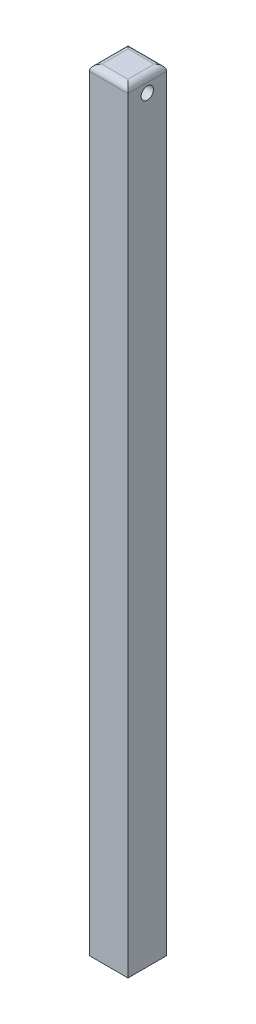
ISO-10303-21;
HEADER;
FILE_DESCRIPTION(('STEP AP214'),'2;1');
FILE_NAME('part.step','',(''),(''),'','','');
FILE_SCHEMA(('AUTOMOTIVE_DESIGN { 1 0 10303 214 1 1 1 1 }'));
ENDSEC;
DATA;
#1=APPLICATION_CONTEXT('core data for automotive mechanical design processes');
#2=APPLICATION_PROTOCOL_DEFINITION('international standard','automotive_design',2000,#1);
#3=PRODUCT_CONTEXT('',#1,'mechanical');
#4=PRODUCT('Part','Part','',(#3));
#5=PRODUCT_RELATED_PRODUCT_CATEGORY('part','',(#4));
#6=PRODUCT_DEFINITION_FORMATION('','',#4);
#7=PRODUCT_DEFINITION_CONTEXT('part definition',#1,'design');
#8=PRODUCT_DEFINITION('design','',#6,#7);
#9=PRODUCT_DEFINITION_SHAPE('','',#8);
#10=(LENGTH_UNIT() NAMED_UNIT(*) SI_UNIT(.MILLI.,.METRE.));
#11=(NAMED_UNIT(*) PLANE_ANGLE_UNIT() SI_UNIT($,.RADIAN.));
#12=(NAMED_UNIT(*) SI_UNIT($,.STERADIAN.) SOLID_ANGLE_UNIT());
#13=UNCERTAINTY_MEASURE_WITH_UNIT(LENGTH_MEASURE(1.E-05),#10,'distance_accuracy_value','');
#14=(GEOMETRIC_REPRESENTATION_CONTEXT(3) GLOBAL_UNCERTAINTY_ASSIGNED_CONTEXT((#13)) GLOBAL_UNIT_ASSIGNED_CONTEXT((#10,
#11,#12)) REPRESENTATION_CONTEXT('',''));
#15=CARTESIAN_POINT('',(0.,0.,0.));
#16=DIRECTION('',(0.,0.,1.));
#17=DIRECTION('',(1.,0.,0.));
#18=AXIS2_PLACEMENT_3D('',#15,#16,#17);
#19=CARTESIAN_POINT('',(2.5547745737113E-11,1221.59090909091,0.));
#20=DIRECTION('',(0.,-1.,0.));
#21=DIRECTION('',(1.,0.,0.));
#22=AXIS2_PLACEMENT_3D('',#19,#20,#21);
#23=PLANE('',#22);
#24=DIRECTION('',(0.,0.,1.));
#25=VECTOR('',#24,1.);
#26=CARTESIAN_POINT('',(42.4999999999996,1221.59090909091,-62.5));
#27=LINE('',#26,#25);
#28=CARTESIAN_POINT('',(42.4999999999996,1221.59090909091,42.5));
#29=VERTEX_POINT('',#28);
#30=CARTESIAN_POINT('',(42.4999999999996,1221.59090909091,-42.5));
#31=VERTEX_POINT('',#30);
#32=EDGE_CURVE('E128',#29,#31,#27,.F.);
#33=ORIENTED_EDGE('',*,*,#32,.T.);
#34=DIRECTION('',(1.,0.,0.));
#35=VECTOR('',#34,1.);
#36=CARTESIAN_POINT('',(-62.5,1221.59090909091,-42.5));
#37=LINE('',#36,#35);
#38=CARTESIAN_POINT('',(-42.5000000000004,1221.59090909091,-42.5));
#39=VERTEX_POINT('',#38);
#40=EDGE_CURVE('E133',#31,#39,#37,.F.);
#41=ORIENTED_EDGE('',*,*,#40,.T.);
#42=DIRECTION('',(0.,0.,-1.));
#43=VECTOR('',#42,1.);
#44=CARTESIAN_POINT('',(-42.5000000000004,1221.59090909091,62.5));
#45=LINE('',#44,#43);
#46=CARTESIAN_POINT('',(-42.5000000000004,1221.59090909091,42.5));
#47=VERTEX_POINT('',#46);
#48=EDGE_CURVE('E130',#39,#47,#45,.F.);
#49=ORIENTED_EDGE('',*,*,#48,.T.);
#50=DIRECTION('',(-1.,0.,0.));
#51=VECTOR('',#50,1.);
#52=CARTESIAN_POINT('',(62.5,1221.59090909091,42.5));
#53=LINE('',#52,#51);
#54=EDGE_CURVE('E126',#47,#29,#53,.F.);
#55=ORIENTED_EDGE('',*,*,#54,.T.);
#56=EDGE_LOOP('',(#33,#41,#49,#55));
#57=FACE_BOUND('',#56,.T.);
#58=ADVANCED_FACE('F35',(#57),#23,.F.);
#59=CARTESIAN_POINT('',(2.5547745737113E-11,-1278.40909090909,0.));
#60=DIRECTION('',(0.,-1.,0.));
#61=DIRECTION('',(1.,0.,0.));
#62=AXIS2_PLACEMENT_3D('',#59,#60,#61);
#63=PLANE('',#62);
#64=DIRECTION('',(-1.,0.,0.));
#65=VECTOR('',#64,1.);
#66=CARTESIAN_POINT('',(62.5,-1278.40909090909,62.5));
#67=LINE('',#66,#65);
#68=CARTESIAN_POINT('',(62.5,-1278.40909090909,62.5));
#69=VERTEX_POINT('',#68);
#70=CARTESIAN_POINT('',(-62.5,-1278.40909090909,62.5));
#71=VERTEX_POINT('',#70);
#72=EDGE_CURVE('E94',#69,#71,#67,.T.);
#73=ORIENTED_EDGE('',*,*,#72,.T.);
#74=DIRECTION('',(0.,0.,-1.));
#75=VECTOR('',#74,1.);
#76=CARTESIAN_POINT('',(-62.5,-1278.40909090909,-62.5));
#77=LINE('',#76,#75);
#78=CARTESIAN_POINT('',(-62.5,-1278.40909090909,-62.5));
#79=VERTEX_POINT('',#78);
#80=EDGE_CURVE('E112',#71,#79,#77,.T.);
#81=ORIENTED_EDGE('',*,*,#80,.T.);
#82=DIRECTION('',(1.,0.,0.));
#83=VECTOR('',#82,1.);
#84=CARTESIAN_POINT('',(62.5,-1278.40909090909,-62.5));
#85=LINE('',#84,#83);
#86=CARTESIAN_POINT('',(62.5,-1278.40909090909,-62.5));
#87=VERTEX_POINT('',#86);
#88=EDGE_CURVE('E104',#79,#87,#85,.T.);
#89=ORIENTED_EDGE('',*,*,#88,.T.);
#90=DIRECTION('',(0.,0.,1.));
#91=VECTOR('',#90,1.);
#92=CARTESIAN_POINT('',(62.5,-1278.40909090909,-62.5));
#93=LINE('',#92,#91);
#94=EDGE_CURVE('E90',#87,#69,#93,.T.);
#95=ORIENTED_EDGE('',*,*,#94,.T.);
#96=EDGE_LOOP('',(#73,#81,#89,#95));
#97=FACE_BOUND('',#96,.T.);
#98=ADVANCED_FACE('F100',(#97),#63,.T.);
#99=CARTESIAN_POINT('',(62.5,1221.59090909091,62.5));
#100=DIRECTION('',(0.,0.,1.));
#101=DIRECTION('',(1.,0.,0.));
#102=AXIS2_PLACEMENT_3D('',#99,#100,#101);
#103=PLANE('',#102);
#104=DIRECTION('',(0.,-1.,0.));
#105=VECTOR('',#104,1.);
#106=CARTESIAN_POINT('',(62.5,1221.59090909091,62.5));
#107=LINE('',#106,#105);
#108=CARTESIAN_POINT('',(62.5,1201.59090909091,62.5));
#109=VERTEX_POINT('',#108);
#110=EDGE_CURVE('E87',#109,#69,#107,.T.);
#111=ORIENTED_EDGE('',*,*,#110,.F.);
#112=DIRECTION('',(-1.,0.,0.));
#113=VECTOR('',#112,1.);
#114=CARTESIAN_POINT('',(-62.4999999999996,1201.59090909091,62.5));
#115=LINE('',#114,#113);
#116=CARTESIAN_POINT('',(-62.5,1201.59090909091,62.5));
#117=VERTEX_POINT('',#116);
#118=EDGE_CURVE('E11',#109,#117,#115,.T.);
#119=ORIENTED_EDGE('',*,*,#118,.T.);
#120=DIRECTION('',(0.,-1.,0.));
#121=VECTOR('',#120,1.);
#122=CARTESIAN_POINT('',(-62.5,1221.59090909091,62.5));
#123=LINE('',#122,#121);
#124=EDGE_CURVE('E110',#117,#71,#123,.T.);
#125=ORIENTED_EDGE('',*,*,#124,.T.);
#126=ORIENTED_EDGE('',*,*,#72,.F.);
#127=EDGE_LOOP('',(#111,#119,#125,#126));
#128=FACE_BOUND('',#127,.T.);
#129=ADVANCED_FACE('F108',(#128),#103,.T.);
#130=CARTESIAN_POINT('',(-62.5,1221.59090909091,-62.5));
#131=DIRECTION('',(-1.,0.,0.));
#132=DIRECTION('',(0.,0.,1.));
#133=AXIS2_PLACEMENT_3D('',#130,#131,#132);
#134=PLANE('',#133);
#135=CARTESIAN_POINT('',(-62.5,1171.59090909091,0.));
#136=DIRECTION('',(1.,0.,0.));
#137=DIRECTION('',(0.,0.,-1.));
#138=AXIS2_PLACEMENT_3D('',#135,#136,#137);
#139=CIRCLE('',#138,20.);
#140=CARTESIAN_POINT('',(-62.5,1171.59090909091,-20.));
#141=VERTEX_POINT('',#140);
#142=EDGE_CURVE('E115',#141,#141,#139,.T.);
#143=ORIENTED_EDGE('',*,*,#142,.T.);
#144=EDGE_LOOP('',(#143));
#145=FACE_BOUND('',#144,.T.);
#146=ORIENTED_EDGE('',*,*,#124,.F.);
#147=DIRECTION('',(0.,0.,-1.));
#148=VECTOR('',#147,1.);
#149=CARTESIAN_POINT('',(-62.5,1201.59090909091,-62.5));
#150=LINE('',#149,#148);
#151=CARTESIAN_POINT('',(-62.5,1201.59090909091,-62.5));
#152=VERTEX_POINT('',#151);
#153=EDGE_CURVE('E105',#117,#152,#150,.T.);
#154=ORIENTED_EDGE('',*,*,#153,.T.);
#155=DIRECTION('',(0.,-1.,0.));
#156=VECTOR('',#155,1.);
#157=CARTESIAN_POINT('',(-62.5,1221.59090909091,-62.5));
#158=LINE('',#157,#156);
#159=EDGE_CURVE('E118',#152,#79,#158,.T.);
#160=ORIENTED_EDGE('',*,*,#159,.T.);
#161=ORIENTED_EDGE('',*,*,#80,.F.);
#162=EDGE_LOOP('',(#146,#154,#160,#161));
#163=FACE_BOUND('',#162,.T.);
#164=ADVANCED_FACE('F152',(#145,#163),#134,.T.);
#165=CARTESIAN_POINT('',(62.5,1221.59090909091,-62.5));
#166=DIRECTION('',(0.,0.,-1.));
#167=DIRECTION('',(-1.,0.,0.));
#168=AXIS2_PLACEMENT_3D('',#165,#166,#167);
#169=PLANE('',#168);
#170=ORIENTED_EDGE('',*,*,#159,.F.);
#171=DIRECTION('',(1.,0.,0.));
#172=VECTOR('',#171,1.);
#173=CARTESIAN_POINT('',(62.5000000000004,1201.59090909091,-62.5));
#174=LINE('',#173,#172);
#175=CARTESIAN_POINT('',(62.5,1201.59090909091,-62.5));
#176=VERTEX_POINT('',#175);
#177=EDGE_CURVE('E44',#152,#176,#174,.T.);
#178=ORIENTED_EDGE('',*,*,#177,.T.);
#179=DIRECTION('',(0.,-1.,0.));
#180=VECTOR('',#179,1.);
#181=CARTESIAN_POINT('',(62.5,1221.59090909091,-62.5));
#182=LINE('',#181,#180);
#183=EDGE_CURVE('E106',#176,#87,#182,.T.);
#184=ORIENTED_EDGE('',*,*,#183,.T.);
#185=ORIENTED_EDGE('',*,*,#88,.F.);
#186=EDGE_LOOP('',(#170,#178,#184,#185));
#187=FACE_BOUND('',#186,.T.);
#188=ADVANCED_FACE('F165',(#187),#169,.T.);
#189=CARTESIAN_POINT('',(62.5,1221.59090909091,-62.5));
#190=DIRECTION('',(1.,0.,0.));
#191=DIRECTION('',(0.,0.,-1.));
#192=AXIS2_PLACEMENT_3D('',#189,#190,#191);
#193=PLANE('',#192);
#194=CARTESIAN_POINT('',(62.5,1171.59090909091,0.));
#195=DIRECTION('',(1.,0.,0.));
#196=DIRECTION('',(0.,0.,-1.));
#197=AXIS2_PLACEMENT_3D('',#194,#195,#196);
#198=CIRCLE('',#197,20.);
#199=CARTESIAN_POINT('',(62.5,1171.59090909091,-20.));
#200=VERTEX_POINT('',#199);
#201=EDGE_CURVE('E95',#200,#200,#198,.T.);
#202=ORIENTED_EDGE('',*,*,#201,.F.);
#203=EDGE_LOOP('',(#202));
#204=FACE_BOUND('',#203,.T.);
#205=ORIENTED_EDGE('',*,*,#183,.F.);
#206=DIRECTION('',(0.,0.,1.));
#207=VECTOR('',#206,1.);
#208=CARTESIAN_POINT('',(62.5,1201.59090909091,62.5));
#209=LINE('',#208,#207);
#210=EDGE_CURVE('E52',#176,#109,#209,.T.);
#211=ORIENTED_EDGE('',*,*,#210,.T.);
#212=ORIENTED_EDGE('',*,*,#110,.T.);
#213=ORIENTED_EDGE('',*,*,#94,.F.);
#214=EDGE_LOOP('',(#205,#211,#212,#213));
#215=FACE_BOUND('',#214,.T.);
#216=ADVANCED_FACE('F89',(#204,#215),#193,.T.);
#217=CARTESIAN_POINT('',(-62.5,1171.59090909091,0.));
#218=DIRECTION('',(1.,0.,0.));
#219=DIRECTION('',(0.,0.,-1.));
#220=AXIS2_PLACEMENT_3D('',#217,#218,#219);
#221=CYLINDRICAL_SURFACE('',#220,20.);
#222=ORIENTED_EDGE('',*,*,#201,.T.);
#223=EDGE_LOOP('',(#222));
#224=FACE_BOUND('',#223,.T.);
#225=ORIENTED_EDGE('',*,*,#142,.F.);
#226=EDGE_LOOP('',(#225));
#227=FACE_BOUND('',#226,.T.);
#228=ADVANCED_FACE('F155',(#224,#227),#221,.F.);
#229=CARTESIAN_POINT('',(42.5,1201.59090909091,-62.5));
#230=DIRECTION('',(0.,0.,-1.));
#231=DIRECTION('',(-1.,0.,0.));
#232=AXIS2_PLACEMENT_3D('',#229,#230,#231);
#233=CYLINDRICAL_SURFACE('',#232,20.);
#234=CARTESIAN_POINT('',(42.5,1201.59090909091,-42.5));
#235=DIRECTION('',(-0.707106781186547,0.,-0.707106781186547));
#236=DIRECTION('',(-0.707106781186547,0.,0.707106781186547));
#237=AXIS2_PLACEMENT_3D('',#234,#235,#236);
#238=ELLIPSE('',#237,28.2842712474619,20.);
#239=EDGE_CURVE('E140',#31,#176,#238,.T.);
#240=ORIENTED_EDGE('',*,*,#239,.F.);
#241=ORIENTED_EDGE('',*,*,#32,.F.);
#242=CARTESIAN_POINT('',(42.5,1201.59090909091,42.5));
#243=DIRECTION('',(0.707106781186547,0.,-0.707106781186547));
#244=DIRECTION('',(0.707106781186547,0.,0.707106781186547));
#245=AXIS2_PLACEMENT_3D('',#242,#243,#244);
#246=ELLIPSE('',#245,28.2842712474619,20.);
#247=EDGE_CURVE('E39',#109,#29,#246,.F.);
#248=ORIENTED_EDGE('',*,*,#247,.F.);
#249=ORIENTED_EDGE('',*,*,#210,.F.);
#250=EDGE_LOOP('',(#240,#241,#248,#249));
#251=FACE_BOUND('',#250,.T.);
#252=ADVANCED_FACE('F37',(#251),#233,.T.);
#253=CARTESIAN_POINT('',(62.5000000000004,1201.59090909091,42.5));
#254=DIRECTION('',(1.,0.,0.));
#255=DIRECTION('',(0.,1.,0.));
#256=AXIS2_PLACEMENT_3D('',#253,#254,#255);
#257=CYLINDRICAL_SURFACE('',#256,20.);
#258=ORIENTED_EDGE('',*,*,#247,.T.);
#259=ORIENTED_EDGE('',*,*,#54,.F.);
#260=CARTESIAN_POINT('',(-42.5,1201.59090909091,42.5));
#261=DIRECTION('',(0.707106781186547,0.,0.707106781186547));
#262=DIRECTION('',(0.707106781186547,0.,-0.707106781186547));
#263=AXIS2_PLACEMENT_3D('',#260,#261,#262);
#264=ELLIPSE('',#263,28.2842712474619,20.);
#265=EDGE_CURVE('E139',#117,#47,#264,.F.);
#266=ORIENTED_EDGE('',*,*,#265,.F.);
#267=ORIENTED_EDGE('',*,*,#118,.F.);
#268=EDGE_LOOP('',(#258,#259,#266,#267));
#269=FACE_BOUND('',#268,.T.);
#270=ADVANCED_FACE('F163',(#269),#257,.T.);
#271=CARTESIAN_POINT('',(62.5000000000004,1201.59090909091,-42.5));
#272=DIRECTION('',(-1.,0.,0.));
#273=DIRECTION('',(0.,-1.,0.));
#274=AXIS2_PLACEMENT_3D('',#271,#272,#273);
#275=CYLINDRICAL_SURFACE('',#274,20.);
#276=ORIENTED_EDGE('',*,*,#239,.T.);
#277=ORIENTED_EDGE('',*,*,#177,.F.);
#278=CARTESIAN_POINT('',(-42.5,1201.59090909091,-42.5));
#279=DIRECTION('',(-0.707106781186547,0.,0.707106781186547));
#280=DIRECTION('',(-0.707106781186547,0.,-0.707106781186547));
#281=AXIS2_PLACEMENT_3D('',#278,#279,#280);
#282=ELLIPSE('',#281,28.2842712474619,20.);
#283=EDGE_CURVE('E137',#39,#152,#282,.T.);
#284=ORIENTED_EDGE('',*,*,#283,.F.);
#285=ORIENTED_EDGE('',*,*,#40,.F.);
#286=EDGE_LOOP('',(#276,#277,#284,#285));
#287=FACE_BOUND('',#286,.T.);
#288=ADVANCED_FACE('F180',(#287),#275,.T.);
#289=CARTESIAN_POINT('',(-42.5,1201.59090909091,-62.5));
#290=DIRECTION('',(0.,0.,1.));
#291=DIRECTION('',(1.,0.,0.));
#292=AXIS2_PLACEMENT_3D('',#289,#290,#291);
#293=CYLINDRICAL_SURFACE('',#292,20.);
#294=ORIENTED_EDGE('',*,*,#265,.T.);
#295=ORIENTED_EDGE('',*,*,#48,.F.);
#296=ORIENTED_EDGE('',*,*,#283,.T.);
#297=ORIENTED_EDGE('',*,*,#153,.F.);
#298=EDGE_LOOP('',(#294,#295,#296,#297));
#299=FACE_BOUND('',#298,.T.);
#300=ADVANCED_FACE('F177',(#299),#293,.T.);
#301=CLOSED_SHELL('',(#58,#98,#129,#164,#188,#216,#228,#252,#270,#288,#300));
#302=MANIFOLD_SOLID_BREP('B2',#301);
#303=ADVANCED_BREP_SHAPE_REPRESENTATION('',(#18,#302),#14);
#304=SHAPE_DEFINITION_REPRESENTATION(#9,#303);
ENDSEC;
END-ISO-10303-21;
